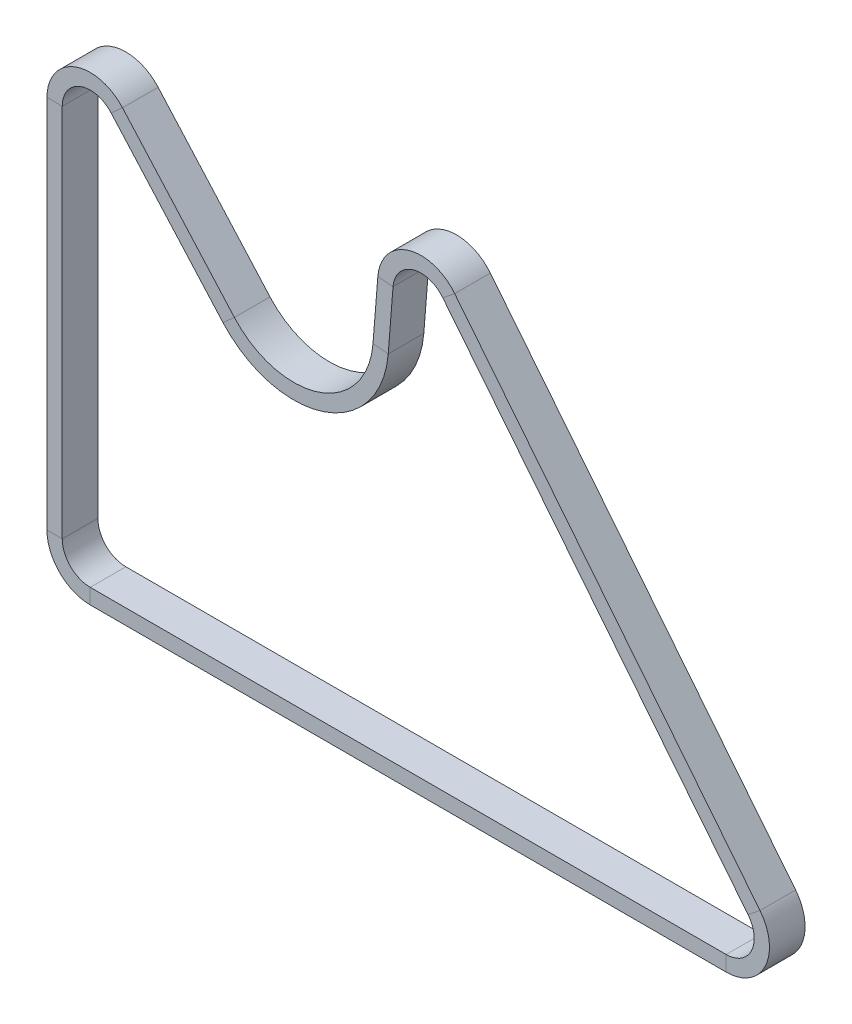
ISO-10303-21;
HEADER;
FILE_DESCRIPTION(('STEP AP214'),'2;1');
FILE_NAME('part.step','',(''),(''),'','','');
FILE_SCHEMA(('AUTOMOTIVE_DESIGN { 1 0 10303 214 1 1 1 1 }'));
ENDSEC;
DATA;
#1=APPLICATION_CONTEXT('core data for automotive mechanical design processes');
#2=APPLICATION_PROTOCOL_DEFINITION('international standard','automotive_design',2000,#1);
#3=PRODUCT_CONTEXT('',#1,'mechanical');
#4=PRODUCT('Part','Part','',(#3));
#5=PRODUCT_RELATED_PRODUCT_CATEGORY('part','',(#4));
#6=PRODUCT_DEFINITION_FORMATION('','',#4);
#7=PRODUCT_DEFINITION_CONTEXT('part definition',#1,'design');
#8=PRODUCT_DEFINITION('design','',#6,#7);
#9=PRODUCT_DEFINITION_SHAPE('','',#8);
#10=(LENGTH_UNIT() NAMED_UNIT(*) SI_UNIT(.MILLI.,.METRE.));
#11=(NAMED_UNIT(*) PLANE_ANGLE_UNIT() SI_UNIT($,.RADIAN.));
#12=(NAMED_UNIT(*) SI_UNIT($,.STERADIAN.) SOLID_ANGLE_UNIT());
#13=UNCERTAINTY_MEASURE_WITH_UNIT(LENGTH_MEASURE(1.E-05),#10,'distance_accuracy_value','');
#14=(GEOMETRIC_REPRESENTATION_CONTEXT(3) GLOBAL_UNCERTAINTY_ASSIGNED_CONTEXT((#13)) GLOBAL_UNIT_ASSIGNED_CONTEXT((#10,
#11,#12)) REPRESENTATION_CONTEXT('',''));
#15=CARTESIAN_POINT('',(0.,0.,0.));
#16=DIRECTION('',(0.,0.,1.));
#17=DIRECTION('',(1.,0.,0.));
#18=AXIS2_PLACEMENT_3D('',#15,#16,#17);
#19=CARTESIAN_POINT('',(200.000000000002,-131.000000000004,-7.));
#20=DIRECTION('',(0.,1.,0.));
#21=DIRECTION('',(0.,0.,1.));
#22=AXIS2_PLACEMENT_3D('',#19,#20,#21);
#23=PLANE('',#22);
#24=DIRECTION('',(-1.,0.,0.));
#25=VECTOR('',#24,1.);
#26=CARTESIAN_POINT('',(200.000000000002,-131.000000000004,7.));
#27=LINE('',#26,#25);
#28=CARTESIAN_POINT('',(200.000000000038,-131.000000000003,7.));
#29=VERTEX_POINT('',#28);
#30=CARTESIAN_POINT('',(-49.9999999999998,-131.000000000003,7.));
#31=VERTEX_POINT('',#30);
#32=EDGE_CURVE('E11',#29,#31,#27,.T.);
#33=ORIENTED_EDGE('',*,*,#32,.F.);
#34=DIRECTION('',(0.,0.,-1.));
#35=VECTOR('',#34,1.);
#36=CARTESIAN_POINT('',(200.000000000038,-131.000000000017,-7.));
#37=LINE('',#36,#35);
#38=CARTESIAN_POINT('',(200.000000000038,-131.000000000003,-7.));
#39=VERTEX_POINT('',#38);
#40=EDGE_CURVE('E44',#29,#39,#37,.T.);
#41=ORIENTED_EDGE('',*,*,#40,.T.);
#42=DIRECTION('',(-1.,0.,0.));
#43=VECTOR('',#42,1.);
#44=CARTESIAN_POINT('',(200.000000000002,-131.000000000004,-7.));
#45=LINE('',#44,#43);
#46=CARTESIAN_POINT('',(-49.9999999999998,-131.000000000003,-7.));
#47=VERTEX_POINT('',#46);
#48=EDGE_CURVE('E192',#39,#47,#45,.T.);
#49=ORIENTED_EDGE('',*,*,#48,.T.);
#50=DIRECTION('',(0.,0.,-1.));
#51=VECTOR('',#50,1.);
#52=CARTESIAN_POINT('',(-49.9999999999998,-131.000000000003,-7.));
#53=LINE('',#52,#51);
#54=EDGE_CURVE('E195',#31,#47,#53,.T.);
#55=ORIENTED_EDGE('',*,*,#54,.F.);
#56=EDGE_LOOP('',(#33,#41,#49,#55));
#57=FACE_BOUND('',#56,.T.);
#58=ADVANCED_FACE('F41',(#57),#23,.T.);
#59=CARTESIAN_POINT('',(200.000000000002,-131.000000000004,7.));
#60=DIRECTION('',(0.,0.,1.));
#61=DIRECTION('',(0.,-1.,0.));
#62=AXIS2_PLACEMENT_3D('',#59,#60,#61);
#63=PLANE('',#62);
#64=DIRECTION('',(-1.,0.,0.));
#65=VECTOR('',#64,1.);
#66=CARTESIAN_POINT('',(200.000000000002,-137.000000000004,7.));
#67=LINE('',#66,#65);
#68=CARTESIAN_POINT('',(200.000000000038,-137.000000000003,7.));
#69=VERTEX_POINT('',#68);
#70=CARTESIAN_POINT('',(-49.9999999999998,-137.000000000003,7.));
#71=VERTEX_POINT('',#70);
#72=EDGE_CURVE('E49',#69,#71,#67,.T.);
#73=ORIENTED_EDGE('',*,*,#72,.F.);
#74=DIRECTION('',(0.,1.,0.));
#75=VECTOR('',#74,1.);
#76=CARTESIAN_POINT('',(200.000000000038,-131.000000000017,7.));
#77=LINE('',#76,#75);
#78=EDGE_CURVE('E367',#69,#29,#77,.T.);
#79=ORIENTED_EDGE('',*,*,#78,.T.);
#80=ORIENTED_EDGE('',*,*,#32,.T.);
#81=DIRECTION('',(0.,1.,0.));
#82=VECTOR('',#81,1.);
#83=CARTESIAN_POINT('',(-49.9999999999998,-131.000000000003,7.));
#84=LINE('',#83,#82);
#85=EDGE_CURVE('E220',#71,#31,#84,.T.);
#86=ORIENTED_EDGE('',*,*,#85,.F.);
#87=EDGE_LOOP('',(#73,#79,#80,#86));
#88=FACE_BOUND('',#87,.T.);
#89=ADVANCED_FACE('F449',(#88),#63,.T.);
#90=CARTESIAN_POINT('',(200.000000000002,-137.000000000004,-7.));
#91=DIRECTION('',(0.,-1.,0.));
#92=DIRECTION('',(0.,0.,-1.));
#93=AXIS2_PLACEMENT_3D('',#90,#91,#92);
#94=PLANE('',#93);
#95=DIRECTION('',(-1.,0.,0.));
#96=VECTOR('',#95,1.);
#97=CARTESIAN_POINT('',(200.000000000002,-137.000000000004,-7.));
#98=LINE('',#97,#96);
#99=CARTESIAN_POINT('',(200.000000000038,-137.000000000003,-7.));
#100=VERTEX_POINT('',#99);
#101=CARTESIAN_POINT('',(-49.9999999999998,-137.000000000003,-7.));
#102=VERTEX_POINT('',#101);
#103=EDGE_CURVE('E201',#100,#102,#98,.T.);
#104=ORIENTED_EDGE('',*,*,#103,.F.);
#105=DIRECTION('',(0.,0.,1.));
#106=VECTOR('',#105,1.);
#107=CARTESIAN_POINT('',(200.000000000038,-137.000000000017,-7.));
#108=LINE('',#107,#106);
#109=EDGE_CURVE('E312',#100,#69,#108,.T.);
#110=ORIENTED_EDGE('',*,*,#109,.T.);
#111=ORIENTED_EDGE('',*,*,#72,.T.);
#112=DIRECTION('',(0.,0.,1.));
#113=VECTOR('',#112,1.);
#114=CARTESIAN_POINT('',(-49.9999999999998,-137.000000000003,-7.));
#115=LINE('',#114,#113);
#116=EDGE_CURVE('E224',#102,#71,#115,.T.);
#117=ORIENTED_EDGE('',*,*,#116,.F.);
#118=EDGE_LOOP('',(#104,#110,#111,#117));
#119=FACE_BOUND('',#118,.T.);
#120=ADVANCED_FACE('F453',(#119),#94,.T.);
#121=CARTESIAN_POINT('',(200.000000000004,-120.000000000003,0.));
#122=DIRECTION('',(0.,0.,-1.));
#123=DIRECTION('',(-1.,0.,0.));
#124=AXIS2_PLACEMENT_3D('',#121,#122,#123);
#125=CYLINDRICAL_SURFACE('',#124,10.9999999999995);
#126=ORIENTED_EDGE('',*,*,#40,.F.);
#127=CARTESIAN_POINT('',(200.000000000004,-120.000000000003,7.));
#128=DIRECTION('',(0.,0.,-1.));
#129=DIRECTION('',(0.780868809442791,0.624695047554723,0.));
#130=AXIS2_PLACEMENT_3D('',#127,#128,#129);
#131=CIRCLE('',#130,10.9999999999995);
#132=CARTESIAN_POINT('',(208.589556903873,-113.128354476901,7.));
#133=VERTEX_POINT('',#132);
#134=EDGE_CURVE('E406',#133,#29,#131,.T.);
#135=ORIENTED_EDGE('',*,*,#134,.F.);
#136=DIRECTION('',(0.,0.,-1.));
#137=VECTOR('',#136,1.);
#138=CARTESIAN_POINT('',(208.589556903873,-113.128354476901,-7.));
#139=LINE('',#138,#137);
#140=CARTESIAN_POINT('',(208.589556903873,-113.128354476901,-7.));
#141=VERTEX_POINT('',#140);
#142=EDGE_CURVE('E315',#133,#141,#139,.T.);
#143=ORIENTED_EDGE('',*,*,#142,.T.);
#144=CARTESIAN_POINT('',(200.000000000004,-120.000000000003,-7.));
#145=DIRECTION('',(0.,0.,-1.));
#146=DIRECTION('',(0.780868809442791,0.624695047554723,0.));
#147=AXIS2_PLACEMENT_3D('',#144,#145,#146);
#148=CIRCLE('',#147,10.9999999999995);
#149=EDGE_CURVE('E309',#141,#39,#148,.T.);
#150=ORIENTED_EDGE('',*,*,#149,.T.);
#151=EDGE_LOOP('',(#126,#135,#143,#150));
#152=FACE_BOUND('',#151,.T.);
#153=ADVANCED_FACE('F425',(#152),#125,.F.);
#154=CARTESIAN_POINT('',(208.589556903874,-113.128354476902,7.));
#155=DIRECTION('',(0.,0.,1.));
#156=DIRECTION('',(1.,0.,0.));
#157=AXIS2_PLACEMENT_3D('',#154,#155,#156);
#158=PLANE('',#157);
#159=ORIENTED_EDGE('',*,*,#134,.T.);
#160=ORIENTED_EDGE('',*,*,#78,.F.);
#161=CARTESIAN_POINT('',(200.000000000004,-120.000000000003,7.));
#162=DIRECTION('',(0.,0.,-1.));
#163=DIRECTION('',(0.780868809442796,0.624695047554718,0.));
#164=AXIS2_PLACEMENT_3D('',#161,#162,#163);
#165=CIRCLE('',#164,16.9999999999995);
#166=CARTESIAN_POINT('',(213.274769760531,-109.380184191575,7.));
#167=VERTEX_POINT('',#166);
#168=EDGE_CURVE('E364',#167,#69,#165,.T.);
#169=ORIENTED_EDGE('',*,*,#168,.F.);
#170=DIRECTION('',(-0.780868809443032,-0.624695047554422,0.));
#171=VECTOR('',#170,1.);
#172=CARTESIAN_POINT('',(208.589556903873,-113.128354476901,7.));
#173=LINE('',#172,#171);
#174=EDGE_CURVE('E360',#167,#133,#173,.T.);
#175=ORIENTED_EDGE('',*,*,#174,.T.);
#176=EDGE_LOOP('',(#159,#160,#169,#175));
#177=FACE_BOUND('',#176,.T.);
#178=ADVANCED_FACE('F462',(#177),#158,.T.);
#179=CARTESIAN_POINT('',(200.000000000004,-120.000000000003,0.));
#180=DIRECTION('',(0.,0.,-1.));
#181=DIRECTION('',(-1.,0.,0.));
#182=AXIS2_PLACEMENT_3D('',#179,#180,#181);
#183=CYLINDRICAL_SURFACE('',#182,16.9999999999995);
#184=ORIENTED_EDGE('',*,*,#168,.T.);
#185=ORIENTED_EDGE('',*,*,#109,.F.);
#186=CARTESIAN_POINT('',(200.000000000004,-120.000000000003,-7.));
#187=DIRECTION('',(0.,0.,-1.));
#188=DIRECTION('',(0.780868809442796,0.624695047554718,0.));
#189=AXIS2_PLACEMENT_3D('',#186,#187,#188);
#190=CIRCLE('',#189,16.9999999999995);
#191=CARTESIAN_POINT('',(213.274769760531,-109.380184191575,-7.));
#192=VERTEX_POINT('',#191);
#193=EDGE_CURVE('E308',#192,#100,#190,.T.);
#194=ORIENTED_EDGE('',*,*,#193,.F.);
#195=DIRECTION('',(0.,0.,1.));
#196=VECTOR('',#195,1.);
#197=CARTESIAN_POINT('',(213.274769760531,-109.380184191575,-7.));
#198=LINE('',#197,#196);
#199=EDGE_CURVE('E301',#192,#167,#198,.T.);
#200=ORIENTED_EDGE('',*,*,#199,.T.);
#201=EDGE_LOOP('',(#184,#185,#194,#200));
#202=FACE_BOUND('',#201,.T.);
#203=ADVANCED_FACE('F433',(#202),#183,.T.);
#204=CARTESIAN_POINT('',(208.589556903874,-113.128354476902,-7.));
#205=DIRECTION('',(0.,0.,-1.));
#206=DIRECTION('',(-1.,0.,0.));
#207=AXIS2_PLACEMENT_3D('',#204,#205,#206);
#208=PLANE('',#207);
#209=ORIENTED_EDGE('',*,*,#193,.T.);
#210=DIRECTION('',(0.,-1.,0.));
#211=VECTOR('',#210,1.);
#212=CARTESIAN_POINT('',(200.000000000038,-131.000000000017,-7.));
#213=LINE('',#212,#211);
#214=EDGE_CURVE('E306',#39,#100,#213,.T.);
#215=ORIENTED_EDGE('',*,*,#214,.F.);
#216=ORIENTED_EDGE('',*,*,#149,.F.);
#217=DIRECTION('',(0.780868809443032,0.624695047554422,0.));
#218=VECTOR('',#217,1.);
#219=CARTESIAN_POINT('',(208.589556903873,-113.128354476901,-7.));
#220=LINE('',#219,#218);
#221=EDGE_CURVE('E298',#141,#192,#220,.T.);
#222=ORIENTED_EDGE('',*,*,#221,.T.);
#223=EDGE_LOOP('',(#209,#215,#216,#222));
#224=FACE_BOUND('',#223,.T.);
#225=ADVANCED_FACE('F430',(#224),#208,.T.);
#226=CARTESIAN_POINT('',(88.5895569038716,36.8716455230975,-7.));
#227=DIRECTION('',(-0.780868809443024,-0.624695047554433,0.));
#228=DIRECTION('',(0.624695047554433,-0.780868809443024,0.));
#229=AXIS2_PLACEMENT_3D('',#226,#227,#228);
#230=PLANE('',#229);
#231=ORIENTED_EDGE('',*,*,#142,.F.);
#232=DIRECTION('',(0.624695047554433,-0.780868809443024,0.));
#233=VECTOR('',#232,1.);
#234=CARTESIAN_POINT('',(88.5895569038716,36.8716455230975,7.));
#235=LINE('',#234,#233);
#236=CARTESIAN_POINT('',(88.5895569038716,36.8716455230975,7.));
#237=VERTEX_POINT('',#236);
#238=EDGE_CURVE('E115',#237,#133,#235,.T.);
#239=ORIENTED_EDGE('',*,*,#238,.F.);
#240=DIRECTION('',(0.,0.,-1.));
#241=VECTOR('',#240,1.);
#242=CARTESIAN_POINT('',(88.5895569038716,36.8716455230975,-7.));
#243=LINE('',#242,#241);
#244=CARTESIAN_POINT('',(88.5895569038716,36.8716455230975,-7.));
#245=VERTEX_POINT('',#244);
#246=EDGE_CURVE('E305',#237,#245,#243,.T.);
#247=ORIENTED_EDGE('',*,*,#246,.T.);
#248=DIRECTION('',(0.624695047554433,-0.780868809443024,0.));
#249=VECTOR('',#248,1.);
#250=CARTESIAN_POINT('',(88.5895569038716,36.8716455230975,-7.));
#251=LINE('',#250,#249);
#252=EDGE_CURVE('E303',#245,#141,#251,.T.);
#253=ORIENTED_EDGE('',*,*,#252,.T.);
#254=EDGE_LOOP('',(#231,#239,#247,#253));
#255=FACE_BOUND('',#254,.T.);
#256=ADVANCED_FACE('F444',(#255),#230,.T.);
#257=CARTESIAN_POINT('',(88.5895569038716,36.8716455230975,7.));
#258=DIRECTION('',(0.,0.,1.));
#259=DIRECTION('',(1.,0.,0.));
#260=AXIS2_PLACEMENT_3D('',#257,#258,#259);
#261=PLANE('',#260);
#262=ORIENTED_EDGE('',*,*,#238,.T.);
#263=ORIENTED_EDGE('',*,*,#174,.F.);
#264=DIRECTION('',(0.624695047554433,-0.780868809443024,0.));
#265=VECTOR('',#264,1.);
#266=CARTESIAN_POINT('',(93.2747697605298,40.619815808424,7.));
#267=LINE('',#266,#265);
#268=CARTESIAN_POINT('',(93.2747697605298,40.619815808424,7.));
#269=VERTEX_POINT('',#268);
#270=EDGE_CURVE('E125',#269,#167,#267,.T.);
#271=ORIENTED_EDGE('',*,*,#270,.F.);
#272=DIRECTION('',(-0.780868809443032,-0.624695047554422,0.));
#273=VECTOR('',#272,1.);
#274=CARTESIAN_POINT('',(88.5895569038716,36.8716455230975,7.));
#275=LINE('',#274,#273);
#276=EDGE_CURVE('E357',#269,#237,#275,.T.);
#277=ORIENTED_EDGE('',*,*,#276,.T.);
#278=EDGE_LOOP('',(#262,#263,#271,#277));
#279=FACE_BOUND('',#278,.T.);
#280=ADVANCED_FACE('F436',(#279),#261,.T.);
#281=CARTESIAN_POINT('',(93.2747697605298,40.619815808424,-7.));
#282=DIRECTION('',(0.780868809443024,0.624695047554433,0.));
#283=DIRECTION('',(-0.624695047554433,0.780868809443024,0.));
#284=AXIS2_PLACEMENT_3D('',#281,#282,#283);
#285=PLANE('',#284);
#286=ORIENTED_EDGE('',*,*,#270,.T.);
#287=ORIENTED_EDGE('',*,*,#199,.F.);
#288=DIRECTION('',(0.624695047554433,-0.780868809443024,0.));
#289=VECTOR('',#288,1.);
#290=CARTESIAN_POINT('',(93.2747697605298,40.619815808424,-7.));
#291=LINE('',#290,#289);
#292=CARTESIAN_POINT('',(93.2747697605298,40.619815808424,-7.));
#293=VERTEX_POINT('',#292);
#294=EDGE_CURVE('E133',#293,#192,#291,.T.);
#295=ORIENTED_EDGE('',*,*,#294,.F.);
#296=DIRECTION('',(0.,0.,1.));
#297=VECTOR('',#296,1.);
#298=CARTESIAN_POINT('',(93.2747697605298,40.619815808424,-7.));
#299=LINE('',#298,#297);
#300=EDGE_CURVE('E294',#293,#269,#299,.T.);
#301=ORIENTED_EDGE('',*,*,#300,.T.);
#302=EDGE_LOOP('',(#286,#287,#295,#301));
#303=FACE_BOUND('',#302,.T.);
#304=ADVANCED_FACE('F434',(#303),#285,.T.);
#305=CARTESIAN_POINT('',(88.5895569038716,36.8716455230975,-7.));
#306=DIRECTION('',(0.,0.,-1.));
#307=DIRECTION('',(-1.,0.,0.));
#308=AXIS2_PLACEMENT_3D('',#305,#306,#307);
#309=PLANE('',#308);
#310=ORIENTED_EDGE('',*,*,#294,.T.);
#311=ORIENTED_EDGE('',*,*,#221,.F.);
#312=ORIENTED_EDGE('',*,*,#252,.F.);
#313=DIRECTION('',(0.780868809443032,0.624695047554422,0.));
#314=VECTOR('',#313,1.);
#315=CARTESIAN_POINT('',(88.5895569038716,36.8716455230975,-7.));
#316=LINE('',#315,#314);
#317=EDGE_CURVE('E288',#245,#293,#316,.T.);
#318=ORIENTED_EDGE('',*,*,#317,.T.);
#319=EDGE_LOOP('',(#310,#311,#312,#318));
#320=FACE_BOUND('',#319,.T.);
#321=ADVANCED_FACE('F428',(#320),#309,.T.);
#322=CARTESIAN_POINT('',(79.9999999999984,29.9999999999987,0.));
#323=DIRECTION('',(0.,0.,-1.));
#324=DIRECTION('',(-1.,0.,0.));
#325=AXIS2_PLACEMENT_3D('',#322,#323,#324);
#326=CYLINDRICAL_SURFACE('',#325,11.);
#327=ORIENTED_EDGE('',*,*,#246,.F.);
#328=CARTESIAN_POINT('',(79.9999999999984,29.9999999999987,7.));
#329=DIRECTION('',(0.,0.,-1.));
#330=DIRECTION('',(-0.996829067740474,0.0795726693510819,0.));
#331=AXIS2_PLACEMENT_3D('',#328,#329,#330);
#332=CIRCLE('',#331,11.);
#333=CARTESIAN_POINT('',(69.0348802548532,30.8752993628606,7.));
#334=VERTEX_POINT('',#333);
#335=EDGE_CURVE('E399',#334,#237,#332,.T.);
#336=ORIENTED_EDGE('',*,*,#335,.F.);
#337=DIRECTION('',(0.,0.,-1.));
#338=VECTOR('',#337,1.);
#339=CARTESIAN_POINT('',(69.0348802548532,30.8752993628606,-7.));
#340=LINE('',#339,#338);
#341=CARTESIAN_POINT('',(69.0348802548532,30.8752993628606,-7.));
#342=VERTEX_POINT('',#341);
#343=EDGE_CURVE('E297',#334,#342,#340,.T.);
#344=ORIENTED_EDGE('',*,*,#343,.T.);
#345=CARTESIAN_POINT('',(79.9999999999984,29.9999999999987,-7.));
#346=DIRECTION('',(0.,0.,-1.));
#347=DIRECTION('',(-0.996829067740474,0.0795726693510819,0.));
#348=AXIS2_PLACEMENT_3D('',#345,#346,#347);
#349=CIRCLE('',#348,11.);
#350=EDGE_CURVE('E291',#342,#245,#349,.T.);
#351=ORIENTED_EDGE('',*,*,#350,.T.);
#352=EDGE_LOOP('',(#327,#336,#344,#351));
#353=FACE_BOUND('',#352,.T.);
#354=ADVANCED_FACE('F442',(#353),#326,.F.);
#355=CARTESIAN_POINT('',(69.0348802548532,30.8752993628606,7.));
#356=DIRECTION('',(0.,0.,1.));
#357=DIRECTION('',(1.,0.,0.));
#358=AXIS2_PLACEMENT_3D('',#355,#356,#357);
#359=PLANE('',#358);
#360=ORIENTED_EDGE('',*,*,#335,.T.);
#361=ORIENTED_EDGE('',*,*,#276,.F.);
#362=CARTESIAN_POINT('',(79.9999999999984,29.9999999999987,7.));
#363=DIRECTION('',(0.,0.,-1.));
#364=DIRECTION('',(-0.996829067740474,0.0795726693510878,0.));
#365=AXIS2_PLACEMENT_3D('',#362,#363,#364);
#366=CIRCLE('',#365,17.);
#367=CARTESIAN_POINT('',(63.0539058484104,31.3527353789672,7.));
#368=VERTEX_POINT('',#367);
#369=EDGE_CURVE('E354',#368,#269,#366,.T.);
#370=ORIENTED_EDGE('',*,*,#369,.F.);
#371=DIRECTION('',(0.996829067740473,-0.0795726693510994,0.));
#372=VECTOR('',#371,1.);
#373=CARTESIAN_POINT('',(69.0348802548532,30.8752993628606,7.));
#374=LINE('',#373,#372);
#375=EDGE_CURVE('E352',#368,#334,#374,.T.);
#376=ORIENTED_EDGE('',*,*,#375,.T.);
#377=EDGE_LOOP('',(#360,#361,#370,#376));
#378=FACE_BOUND('',#377,.T.);
#379=ADVANCED_FACE('F499',(#378),#359,.T.);
#380=CARTESIAN_POINT('',(79.9999999999984,29.9999999999987,0.));
#381=DIRECTION('',(0.,0.,-1.));
#382=DIRECTION('',(-1.,0.,0.));
#383=AXIS2_PLACEMENT_3D('',#380,#381,#382);
#384=CYLINDRICAL_SURFACE('',#383,17.);
#385=ORIENTED_EDGE('',*,*,#369,.T.);
#386=ORIENTED_EDGE('',*,*,#300,.F.);
#387=CARTESIAN_POINT('',(79.9999999999984,29.9999999999987,-7.));
#388=DIRECTION('',(0.,0.,-1.));
#389=DIRECTION('',(-0.996829067740474,0.0795726693510878,0.));
#390=AXIS2_PLACEMENT_3D('',#387,#388,#389);
#391=CIRCLE('',#390,17.);
#392=CARTESIAN_POINT('',(63.0539058484104,31.3527353789672,-7.));
#393=VERTEX_POINT('',#392);
#394=EDGE_CURVE('E290',#393,#293,#391,.T.);
#395=ORIENTED_EDGE('',*,*,#394,.F.);
#396=DIRECTION('',(0.,0.,1.));
#397=VECTOR('',#396,1.);
#398=CARTESIAN_POINT('',(63.0539058484104,31.3527353789672,-7.));
#399=LINE('',#398,#397);
#400=EDGE_CURVE('E284',#393,#368,#399,.T.);
#401=ORIENTED_EDGE('',*,*,#400,.T.);
#402=EDGE_LOOP('',(#385,#386,#395,#401));
#403=FACE_BOUND('',#402,.T.);
#404=ADVANCED_FACE('F557',(#403),#384,.T.);
#405=CARTESIAN_POINT('',(69.0348802548532,30.8752993628606,-7.));
#406=DIRECTION('',(0.,0.,-1.));
#407=DIRECTION('',(-1.,0.,0.));
#408=AXIS2_PLACEMENT_3D('',#405,#406,#407);
#409=PLANE('',#408);
#410=ORIENTED_EDGE('',*,*,#394,.T.);
#411=ORIENTED_EDGE('',*,*,#317,.F.);
#412=ORIENTED_EDGE('',*,*,#350,.F.);
#413=DIRECTION('',(-0.996829067740473,0.0795726693510994,0.));
#414=VECTOR('',#413,1.);
#415=CARTESIAN_POINT('',(69.0348802548532,30.8752993628606,-7.));
#416=LINE('',#415,#414);
#417=EDGE_CURVE('E277',#342,#393,#416,.T.);
#418=ORIENTED_EDGE('',*,*,#417,.T.);
#419=EDGE_LOOP('',(#410,#411,#412,#418));
#420=FACE_BOUND('',#419,.T.);
#421=ADVANCED_FACE('F495',(#420),#409,.T.);
#422=CARTESIAN_POINT('',(67.1318827733333,7.03591806667277,-7.));
#423=DIRECTION('',(0.996829067740474,-0.079572669351086,0.));
#424=DIRECTION('',(0.079572669351086,0.996829067740474,0.));
#425=AXIS2_PLACEMENT_3D('',#422,#423,#424);
#426=PLANE('',#425);
#427=ORIENTED_EDGE('',*,*,#343,.F.);
#428=DIRECTION('',(0.079572669351086,0.996829067740474,0.));
#429=VECTOR('',#428,1.);
#430=CARTESIAN_POINT('',(67.1318827733333,7.03591806667277,7.));
#431=LINE('',#430,#429);
#432=CARTESIAN_POINT('',(67.1318827733332,7.03591806667278,7.));
#433=VERTEX_POINT('',#432);
#434=EDGE_CURVE('E395',#433,#334,#431,.T.);
#435=ORIENTED_EDGE('',*,*,#434,.F.);
#436=DIRECTION('',(0.,0.,-1.));
#437=VECTOR('',#436,1.);
#438=CARTESIAN_POINT('',(67.1318827733333,7.03591806667277,-7.));
#439=LINE('',#438,#437);
#440=CARTESIAN_POINT('',(67.1318827733332,7.03591806667278,-7.));
#441=VERTEX_POINT('',#440);
#442=EDGE_CURVE('E287',#433,#441,#439,.T.);
#443=ORIENTED_EDGE('',*,*,#442,.T.);
#444=DIRECTION('',(0.079572669351086,0.996829067740474,0.));
#445=VECTOR('',#444,1.);
#446=CARTESIAN_POINT('',(67.1318827733333,7.03591806667277,-7.));
#447=LINE('',#446,#445);
#448=EDGE_CURVE('E281',#441,#342,#447,.T.);
#449=ORIENTED_EDGE('',*,*,#448,.T.);
#450=EDGE_LOOP('',(#427,#435,#443,#449));
#451=FACE_BOUND('',#450,.T.);
#452=ADVANCED_FACE('F491',(#451),#426,.T.);
#453=CARTESIAN_POINT('',(67.1318827733333,7.03591806667277,7.));
#454=DIRECTION('',(0.,0.,1.));
#455=DIRECTION('',(1.,0.,0.));
#456=AXIS2_PLACEMENT_3D('',#453,#454,#455);
#457=PLANE('',#456);
#458=ORIENTED_EDGE('',*,*,#434,.T.);
#459=ORIENTED_EDGE('',*,*,#375,.F.);
#460=DIRECTION('',(0.079572669351086,0.996829067740474,0.));
#461=VECTOR('',#460,1.);
#462=CARTESIAN_POINT('',(61.1509083668904,7.51335408277937,7.));
#463=LINE('',#462,#461);
#464=CARTESIAN_POINT('',(61.1509083668904,7.51335408277938,7.));
#465=VERTEX_POINT('',#464);
#466=EDGE_CURVE('E349',#465,#368,#463,.T.);
#467=ORIENTED_EDGE('',*,*,#466,.F.);
#468=DIRECTION('',(0.996829067740473,-0.0795726693510993,0.));
#469=VECTOR('',#468,1.);
#470=CARTESIAN_POINT('',(67.1318827733333,7.03591806667277,7.));
#471=LINE('',#470,#469);
#472=EDGE_CURVE('E346',#465,#433,#471,.T.);
#473=ORIENTED_EDGE('',*,*,#472,.T.);
#474=EDGE_LOOP('',(#458,#459,#467,#473));
#475=FACE_BOUND('',#474,.T.);
#476=ADVANCED_FACE('F494',(#475),#457,.T.);
#477=CARTESIAN_POINT('',(61.1509083668904,7.51335408277937,-7.));
#478=DIRECTION('',(-0.996829067740474,0.079572669351086,0.));
#479=DIRECTION('',(-0.079572669351086,-0.996829067740474,0.));
#480=AXIS2_PLACEMENT_3D('',#477,#478,#479);
#481=PLANE('',#480);
#482=ORIENTED_EDGE('',*,*,#466,.T.);
#483=ORIENTED_EDGE('',*,*,#400,.F.);
#484=DIRECTION('',(0.079572669351086,0.996829067740474,0.));
#485=VECTOR('',#484,1.);
#486=CARTESIAN_POINT('',(61.1509083668904,7.51335408277937,-7.));
#487=LINE('',#486,#485);
#488=CARTESIAN_POINT('',(61.1509083668904,7.51335408277938,-7.));
#489=VERTEX_POINT('',#488);
#490=EDGE_CURVE('E280',#489,#393,#487,.T.);
#491=ORIENTED_EDGE('',*,*,#490,.F.);
#492=DIRECTION('',(0.,0.,1.));
#493=VECTOR('',#492,1.);
#494=CARTESIAN_POINT('',(61.1509083668904,7.51335408277937,-7.));
#495=LINE('',#494,#493);
#496=EDGE_CURVE('E273',#489,#465,#495,.T.);
#497=ORIENTED_EDGE('',*,*,#496,.T.);
#498=EDGE_LOOP('',(#482,#483,#491,#497));
#499=FACE_BOUND('',#498,.T.);
#500=ADVANCED_FACE('F555',(#499),#481,.T.);
#501=CARTESIAN_POINT('',(67.1318827733333,7.03591806667277,-7.));
#502=DIRECTION('',(0.,0.,-1.));
#503=DIRECTION('',(-1.,0.,0.));
#504=AXIS2_PLACEMENT_3D('',#501,#502,#503);
#505=PLANE('',#504);
#506=ORIENTED_EDGE('',*,*,#490,.T.);
#507=ORIENTED_EDGE('',*,*,#417,.F.);
#508=ORIENTED_EDGE('',*,*,#448,.F.);
#509=DIRECTION('',(-0.996829067740473,0.0795726693510993,0.));
#510=VECTOR('',#509,1.);
#511=CARTESIAN_POINT('',(67.1318827733333,7.03591806667277,-7.));
#512=LINE('',#511,#510);
#513=EDGE_CURVE('E266',#441,#489,#512,.T.);
#514=ORIENTED_EDGE('',*,*,#513,.T.);
#515=EDGE_LOOP('',(#506,#507,#508,#514));
#516=FACE_BOUND('',#515,.T.);
#517=ADVANCED_FACE('F489',(#516),#505,.T.);
#518=CARTESIAN_POINT('',(30.0000000000006,10.0000000000008,0.));
#519=DIRECTION('',(0.,0.,1.));
#520=DIRECTION('',(1.,0.,0.));
#521=AXIS2_PLACEMENT_3D('',#518,#519,#520);
#522=CYLINDRICAL_SURFACE('',#521,37.25);
#523=ORIENTED_EDGE('',*,*,#442,.F.);
#524=CARTESIAN_POINT('',(30.0000000000006,10.0000000000008,7.));
#525=DIRECTION('',(0.,0.,1.));
#526=DIRECTION('',(-0.746796329131911,-0.665052812034581,0.));
#527=AXIS2_PLACEMENT_3D('',#524,#525,#526);
#528=CIRCLE('',#527,37.25);
#529=CARTESIAN_POINT('',(2.18183673983689,-14.7732172482874,7.));
#530=VERTEX_POINT('',#529);
#531=EDGE_CURVE('E390',#530,#433,#528,.T.);
#532=ORIENTED_EDGE('',*,*,#531,.F.);
#533=DIRECTION('',(0.,0.,-1.));
#534=VECTOR('',#533,1.);
#535=CARTESIAN_POINT('',(2.18183673983691,-14.7732172482874,-7.));
#536=LINE('',#535,#534);
#537=CARTESIAN_POINT('',(2.18183673983689,-14.7732172482874,-7.));
#538=VERTEX_POINT('',#537);
#539=EDGE_CURVE('E276',#530,#538,#536,.T.);
#540=ORIENTED_EDGE('',*,*,#539,.T.);
#541=CARTESIAN_POINT('',(30.0000000000006,10.0000000000008,-7.));
#542=DIRECTION('',(0.,0.,1.));
#543=DIRECTION('',(-0.746796329131911,-0.665052812034581,0.));
#544=AXIS2_PLACEMENT_3D('',#541,#542,#543);
#545=CIRCLE('',#544,37.25);
#546=EDGE_CURVE('E270',#538,#441,#545,.T.);
#547=ORIENTED_EDGE('',*,*,#546,.T.);
#548=EDGE_LOOP('',(#523,#532,#540,#547));
#549=FACE_BOUND('',#548,.T.);
#550=ADVANCED_FACE('F485',(#549),#522,.T.);
#551=CARTESIAN_POINT('',(2.18183673983688,-14.7732172482874,7.));
#552=DIRECTION('',(0.,0.,1.));
#553=DIRECTION('',(1.,0.,0.));
#554=AXIS2_PLACEMENT_3D('',#551,#552,#553);
#555=PLANE('',#554);
#556=ORIENTED_EDGE('',*,*,#531,.T.);
#557=ORIENTED_EDGE('',*,*,#472,.F.);
#558=CARTESIAN_POINT('',(30.0000000000006,10.0000000000008,7.));
#559=DIRECTION('',(0.,0.,1.));
#560=DIRECTION('',(-0.746796329131909,-0.665052812034582,0.));
#561=AXIS2_PLACEMENT_3D('',#558,#559,#560);
#562=CIRCLE('',#561,31.25);
#563=CARTESIAN_POINT('',(6.66261471462838,-10.78290037608,7.));
#564=VERTEX_POINT('',#563);
#565=EDGE_CURVE('E343',#564,#465,#562,.T.);
#566=ORIENTED_EDGE('',*,*,#565,.F.);
#567=DIRECTION('',(-0.746796329131918,-0.665052812034572,0.));
#568=VECTOR('',#567,1.);
#569=CARTESIAN_POINT('',(2.18183673983691,-14.7732172482874,7.));
#570=LINE('',#569,#568);
#571=EDGE_CURVE('E340',#564,#530,#570,.T.);
#572=ORIENTED_EDGE('',*,*,#571,.T.);
#573=EDGE_LOOP('',(#556,#557,#566,#572));
#574=FACE_BOUND('',#573,.T.);
#575=ADVANCED_FACE('F488',(#574),#555,.T.);
#576=CARTESIAN_POINT('',(30.0000000000006,10.0000000000008,0.));
#577=DIRECTION('',(0.,0.,1.));
#578=DIRECTION('',(1.,0.,0.));
#579=AXIS2_PLACEMENT_3D('',#576,#577,#578);
#580=CYLINDRICAL_SURFACE('',#579,31.25);
#581=ORIENTED_EDGE('',*,*,#565,.T.);
#582=ORIENTED_EDGE('',*,*,#496,.F.);
#583=CARTESIAN_POINT('',(30.0000000000006,10.0000000000008,-7.));
#584=DIRECTION('',(0.,0.,1.));
#585=DIRECTION('',(-0.746796329131909,-0.665052812034582,0.));
#586=AXIS2_PLACEMENT_3D('',#583,#584,#585);
#587=CIRCLE('',#586,31.25);
#588=CARTESIAN_POINT('',(6.66261471462838,-10.78290037608,-7.));
#589=VERTEX_POINT('',#588);
#590=EDGE_CURVE('E269',#589,#489,#587,.T.);
#591=ORIENTED_EDGE('',*,*,#590,.F.);
#592=DIRECTION('',(0.,0.,1.));
#593=VECTOR('',#592,1.);
#594=CARTESIAN_POINT('',(6.6626147146284,-10.78290037608,-7.));
#595=LINE('',#594,#593);
#596=EDGE_CURVE('E262',#589,#564,#595,.T.);
#597=ORIENTED_EDGE('',*,*,#596,.T.);
#598=EDGE_LOOP('',(#581,#582,#591,#597));
#599=FACE_BOUND('',#598,.T.);
#600=ADVANCED_FACE('F541',(#599),#580,.F.);
#601=CARTESIAN_POINT('',(2.18183673983688,-14.7732172482874,-7.));
#602=DIRECTION('',(0.,0.,-1.));
#603=DIRECTION('',(-1.,0.,0.));
#604=AXIS2_PLACEMENT_3D('',#601,#602,#603);
#605=PLANE('',#604);
#606=ORIENTED_EDGE('',*,*,#590,.T.);
#607=ORIENTED_EDGE('',*,*,#513,.F.);
#608=ORIENTED_EDGE('',*,*,#546,.F.);
#609=DIRECTION('',(0.746796329131918,0.665052812034572,0.));
#610=VECTOR('',#609,1.);
#611=CARTESIAN_POINT('',(2.18183673983691,-14.7732172482874,-7.));
#612=LINE('',#611,#610);
#613=EDGE_CURVE('E255',#538,#589,#612,.T.);
#614=ORIENTED_EDGE('',*,*,#613,.T.);
#615=EDGE_LOOP('',(#606,#607,#608,#614));
#616=FACE_BOUND('',#615,.T.);
#617=ADVANCED_FACE('F483',(#616),#605,.T.);
#618=CARTESIAN_POINT('',(-41.7852403795516,34.5979773414613,-7.));
#619=DIRECTION('',(-0.74679632913191,-0.665052812034582,0.));
#620=DIRECTION('',(0.665052812034582,-0.74679632913191,0.));
#621=AXIS2_PLACEMENT_3D('',#618,#619,#620);
#622=PLANE('',#621);
#623=ORIENTED_EDGE('',*,*,#539,.F.);
#624=DIRECTION('',(0.665052812034582,-0.74679632913191,0.));
#625=VECTOR('',#624,1.);
#626=CARTESIAN_POINT('',(-41.7852403795516,34.5979773414613,7.));
#627=LINE('',#626,#625);
#628=CARTESIAN_POINT('',(-41.7852403795516,34.5979773414613,7.));
#629=VERTEX_POINT('',#628);
#630=EDGE_CURVE('E385',#629,#530,#627,.T.);
#631=ORIENTED_EDGE('',*,*,#630,.F.);
#632=DIRECTION('',(0.,0.,-1.));
#633=VECTOR('',#632,1.);
#634=CARTESIAN_POINT('',(-41.7852403795516,34.5979773414613,-7.));
#635=LINE('',#634,#633);
#636=CARTESIAN_POINT('',(-41.7852403795516,34.5979773414613,-7.));
#637=VERTEX_POINT('',#636);
#638=EDGE_CURVE('E265',#629,#637,#635,.T.);
#639=ORIENTED_EDGE('',*,*,#638,.T.);
#640=DIRECTION('',(0.665052812034582,-0.74679632913191,0.));
#641=VECTOR('',#640,1.);
#642=CARTESIAN_POINT('',(-41.7852403795516,34.5979773414613,-7.));
#643=LINE('',#642,#641);
#644=EDGE_CURVE('E259',#637,#538,#643,.T.);
#645=ORIENTED_EDGE('',*,*,#644,.T.);
#646=EDGE_LOOP('',(#623,#631,#639,#645));
#647=FACE_BOUND('',#646,.T.);
#648=ADVANCED_FACE('F479',(#647),#622,.T.);
#649=CARTESIAN_POINT('',(-41.7852403795516,34.5979773414613,7.));
#650=DIRECTION('',(0.,0.,1.));
#651=DIRECTION('',(1.,0.,0.));
#652=AXIS2_PLACEMENT_3D('',#649,#650,#651);
#653=PLANE('',#652);
#654=ORIENTED_EDGE('',*,*,#630,.T.);
#655=ORIENTED_EDGE('',*,*,#571,.F.);
#656=DIRECTION('',(0.665052812034582,-0.74679632913191,0.));
#657=VECTOR('',#656,1.);
#658=CARTESIAN_POINT('',(-37.3044624047601,38.5882942136687,7.));
#659=LINE('',#658,#657);
#660=CARTESIAN_POINT('',(-37.3044624047601,38.5882942136687,7.));
#661=VERTEX_POINT('',#660);
#662=EDGE_CURVE('E337',#661,#564,#659,.T.);
#663=ORIENTED_EDGE('',*,*,#662,.F.);
#664=DIRECTION('',(-0.746796329131918,-0.665052812034572,0.));
#665=VECTOR('',#664,1.);
#666=CARTESIAN_POINT('',(-41.7852403795516,34.5979773414613,7.));
#667=LINE('',#666,#665);
#668=EDGE_CURVE('E334',#661,#629,#667,.T.);
#669=ORIENTED_EDGE('',*,*,#668,.T.);
#670=EDGE_LOOP('',(#654,#655,#663,#669));
#671=FACE_BOUND('',#670,.T.);
#672=ADVANCED_FACE('F482',(#671),#653,.T.);
#673=CARTESIAN_POINT('',(-37.3044624047601,38.5882942136687,-7.));
#674=DIRECTION('',(0.74679632913191,0.665052812034582,0.));
#675=DIRECTION('',(-0.665052812034582,0.74679632913191,0.));
#676=AXIS2_PLACEMENT_3D('',#673,#674,#675);
#677=PLANE('',#676);
#678=ORIENTED_EDGE('',*,*,#662,.T.);
#679=ORIENTED_EDGE('',*,*,#596,.F.);
#680=DIRECTION('',(0.665052812034582,-0.74679632913191,0.));
#681=VECTOR('',#680,1.);
#682=CARTESIAN_POINT('',(-37.3044624047601,38.5882942136687,-7.));
#683=LINE('',#682,#681);
#684=CARTESIAN_POINT('',(-37.3044624047601,38.5882942136687,-7.));
#685=VERTEX_POINT('',#684);
#686=EDGE_CURVE('E258',#685,#589,#683,.T.);
#687=ORIENTED_EDGE('',*,*,#686,.F.);
#688=DIRECTION('',(0.,0.,1.));
#689=VECTOR('',#688,1.);
#690=CARTESIAN_POINT('',(-37.3044624047601,38.5882942136687,-7.));
#691=LINE('',#690,#689);
#692=EDGE_CURVE('E251',#685,#661,#691,.T.);
#693=ORIENTED_EDGE('',*,*,#692,.T.);
#694=EDGE_LOOP('',(#678,#679,#687,#693));
#695=FACE_BOUND('',#694,.T.);
#696=ADVANCED_FACE('F539',(#695),#677,.T.);
#697=CARTESIAN_POINT('',(-41.7852403795516,34.5979773414613,-7.));
#698=DIRECTION('',(0.,0.,-1.));
#699=DIRECTION('',(-1.,0.,0.));
#700=AXIS2_PLACEMENT_3D('',#697,#698,#699);
#701=PLANE('',#700);
#702=ORIENTED_EDGE('',*,*,#686,.T.);
#703=ORIENTED_EDGE('',*,*,#613,.F.);
#704=ORIENTED_EDGE('',*,*,#644,.F.);
#705=DIRECTION('',(0.746796329131918,0.665052812034572,0.));
#706=VECTOR('',#705,1.);
#707=CARTESIAN_POINT('',(-41.7852403795516,34.5979773414613,-7.));
#708=LINE('',#707,#706);
#709=EDGE_CURVE('E244',#637,#685,#708,.T.);
#710=ORIENTED_EDGE('',*,*,#709,.T.);
#711=EDGE_LOOP('',(#702,#703,#704,#710));
#712=FACE_BOUND('',#711,.T.);
#713=ADVANCED_FACE('F477',(#712),#701,.T.);
#714=CARTESIAN_POINT('',(-50.0000000000025,27.2823964090808,0.));
#715=DIRECTION('',(0.,0.,-1.));
#716=DIRECTION('',(-1.,0.,0.));
#717=AXIS2_PLACEMENT_3D('',#714,#715,#716);
#718=CYLINDRICAL_SURFACE('',#717,11.);
#719=ORIENTED_EDGE('',*,*,#638,.F.);
#720=CARTESIAN_POINT('',(-50.0000000000025,27.2823964090808,7.));
#721=DIRECTION('',(0.,0.,-1.));
#722=DIRECTION('',(-1.,0.,0.));
#723=AXIS2_PLACEMENT_3D('',#720,#721,#722);
#724=CIRCLE('',#723,11.);
#725=CARTESIAN_POINT('',(-61.0000000000025,27.2823964090806,7.));
#726=VERTEX_POINT('',#725);
#727=EDGE_CURVE('E380',#726,#629,#724,.T.);
#728=ORIENTED_EDGE('',*,*,#727,.F.);
#729=DIRECTION('',(0.,0.,-1.));
#730=VECTOR('',#729,1.);
#731=CARTESIAN_POINT('',(-61.0000000000025,27.2823964090806,-7.));
#732=LINE('',#731,#730);
#733=CARTESIAN_POINT('',(-61.0000000000025,27.2823964090806,-7.));
#734=VERTEX_POINT('',#733);
#735=EDGE_CURVE('E254',#726,#734,#732,.T.);
#736=ORIENTED_EDGE('',*,*,#735,.T.);
#737=CARTESIAN_POINT('',(-50.0000000000025,27.2823964090808,-7.));
#738=DIRECTION('',(0.,0.,-1.));
#739=DIRECTION('',(-1.,0.,0.));
#740=AXIS2_PLACEMENT_3D('',#737,#738,#739);
#741=CIRCLE('',#740,11.);
#742=EDGE_CURVE('E248',#734,#637,#741,.T.);
#743=ORIENTED_EDGE('',*,*,#742,.T.);
#744=EDGE_LOOP('',(#719,#728,#736,#743));
#745=FACE_BOUND('',#744,.T.);
#746=ADVANCED_FACE('F473',(#745),#718,.F.);
#747=CARTESIAN_POINT('',(-61.0000000000025,27.2823964090806,7.));
#748=DIRECTION('',(0.,0.,1.));
#749=DIRECTION('',(1.,0.,0.));
#750=AXIS2_PLACEMENT_3D('',#747,#748,#749);
#751=PLANE('',#750);
#752=ORIENTED_EDGE('',*,*,#727,.T.);
#753=ORIENTED_EDGE('',*,*,#668,.F.);
#754=CARTESIAN_POINT('',(-50.0000000000025,27.2823964090808,7.));
#755=DIRECTION('',(0.,0.,-1.));
#756=DIRECTION('',(-1.,0.,0.));
#757=AXIS2_PLACEMENT_3D('',#754,#755,#756);
#758=CIRCLE('',#757,17.);
#759=CARTESIAN_POINT('',(-67.0000000000025,27.2823964090806,7.));
#760=VERTEX_POINT('',#759);
#761=EDGE_CURVE('E331',#760,#661,#758,.T.);
#762=ORIENTED_EDGE('',*,*,#761,.F.);
#763=DIRECTION('',(1.,0.,0.));
#764=VECTOR('',#763,1.);
#765=CARTESIAN_POINT('',(-61.0000000000025,27.2823964090806,7.));
#766=LINE('',#765,#764);
#767=EDGE_CURVE('E328',#760,#726,#766,.T.);
#768=ORIENTED_EDGE('',*,*,#767,.T.);
#769=EDGE_LOOP('',(#752,#753,#762,#768));
#770=FACE_BOUND('',#769,.T.);
#771=ADVANCED_FACE('F476',(#770),#751,.T.);
#772=CARTESIAN_POINT('',(-50.0000000000025,27.2823964090808,0.));
#773=DIRECTION('',(0.,0.,-1.));
#774=DIRECTION('',(-1.,0.,0.));
#775=AXIS2_PLACEMENT_3D('',#772,#773,#774);
#776=CYLINDRICAL_SURFACE('',#775,17.);
#777=ORIENTED_EDGE('',*,*,#761,.T.);
#778=ORIENTED_EDGE('',*,*,#692,.F.);
#779=CARTESIAN_POINT('',(-50.0000000000025,27.2823964090808,-7.));
#780=DIRECTION('',(0.,0.,-1.));
#781=DIRECTION('',(-1.,0.,0.));
#782=AXIS2_PLACEMENT_3D('',#779,#780,#781);
#783=CIRCLE('',#782,17.);
#784=CARTESIAN_POINT('',(-67.0000000000025,27.2823964090806,-7.));
#785=VERTEX_POINT('',#784);
#786=EDGE_CURVE('E247',#785,#685,#783,.T.);
#787=ORIENTED_EDGE('',*,*,#786,.F.);
#788=DIRECTION('',(0.,0.,1.));
#789=VECTOR('',#788,1.);
#790=CARTESIAN_POINT('',(-67.0000000000025,27.2823964090806,-7.));
#791=LINE('',#790,#789);
#792=EDGE_CURVE('E240',#785,#760,#791,.T.);
#793=ORIENTED_EDGE('',*,*,#792,.T.);
#794=EDGE_LOOP('',(#777,#778,#787,#793));
#795=FACE_BOUND('',#794,.T.);
#796=ADVANCED_FACE('F523',(#795),#776,.T.);
#797=CARTESIAN_POINT('',(-61.0000000000025,27.2823964090806,-7.));
#798=DIRECTION('',(0.,0.,-1.));
#799=DIRECTION('',(-1.,0.,0.));
#800=AXIS2_PLACEMENT_3D('',#797,#798,#799);
#801=PLANE('',#800);
#802=ORIENTED_EDGE('',*,*,#786,.T.);
#803=ORIENTED_EDGE('',*,*,#709,.F.);
#804=ORIENTED_EDGE('',*,*,#742,.F.);
#805=DIRECTION('',(-1.,0.,0.));
#806=VECTOR('',#805,1.);
#807=CARTESIAN_POINT('',(-61.0000000000025,27.2823964090806,-7.));
#808=LINE('',#807,#806);
#809=EDGE_CURVE('E233',#734,#785,#808,.T.);
#810=ORIENTED_EDGE('',*,*,#809,.T.);
#811=EDGE_LOOP('',(#802,#803,#804,#810));
#812=FACE_BOUND('',#811,.T.);
#813=ADVANCED_FACE('F471',(#812),#801,.T.);
#814=CARTESIAN_POINT('',(-61.,-120.000000000004,-7.));
#815=DIRECTION('',(1.,0.,0.));
#816=DIRECTION('',(0.,1.,0.));
#817=AXIS2_PLACEMENT_3D('',#814,#815,#816);
#818=PLANE('',#817);
#819=ORIENTED_EDGE('',*,*,#735,.F.);
#820=DIRECTION('',(0.,1.,0.));
#821=VECTOR('',#820,1.);
#822=CARTESIAN_POINT('',(-61.,-120.000000000004,7.));
#823=LINE('',#822,#821);
#824=CARTESIAN_POINT('',(-61.,-120.000000000004,7.));
#825=VERTEX_POINT('',#824);
#826=EDGE_CURVE('E375',#825,#726,#823,.T.);
#827=ORIENTED_EDGE('',*,*,#826,.F.);
#828=DIRECTION('',(0.,0.,-1.));
#829=VECTOR('',#828,1.);
#830=CARTESIAN_POINT('',(-61.,-120.000000000004,-7.));
#831=LINE('',#830,#829);
#832=CARTESIAN_POINT('',(-61.,-120.000000000004,-7.));
#833=VERTEX_POINT('',#832);
#834=EDGE_CURVE('E243',#825,#833,#831,.T.);
#835=ORIENTED_EDGE('',*,*,#834,.T.);
#836=DIRECTION('',(0.,1.,0.));
#837=VECTOR('',#836,1.);
#838=CARTESIAN_POINT('',(-61.,-120.000000000004,-7.));
#839=LINE('',#838,#837);
#840=EDGE_CURVE('E237',#833,#734,#839,.T.);
#841=ORIENTED_EDGE('',*,*,#840,.T.);
#842=EDGE_LOOP('',(#819,#827,#835,#841));
#843=FACE_BOUND('',#842,.T.);
#844=ADVANCED_FACE('F467',(#843),#818,.T.);
#845=CARTESIAN_POINT('',(-61.,-120.000000000004,7.));
#846=DIRECTION('',(0.,0.,1.));
#847=DIRECTION('',(1.,0.,0.));
#848=AXIS2_PLACEMENT_3D('',#845,#846,#847);
#849=PLANE('',#848);
#850=ORIENTED_EDGE('',*,*,#826,.T.);
#851=ORIENTED_EDGE('',*,*,#767,.F.);
#852=DIRECTION('',(0.,1.,0.));
#853=VECTOR('',#852,1.);
#854=CARTESIAN_POINT('',(-67.,-120.000000000004,7.));
#855=LINE('',#854,#853);
#856=CARTESIAN_POINT('',(-67.,-120.000000000004,7.));
#857=VERTEX_POINT('',#856);
#858=EDGE_CURVE('E325',#857,#760,#855,.T.);
#859=ORIENTED_EDGE('',*,*,#858,.F.);
#860=DIRECTION('',(1.,0.,0.));
#861=VECTOR('',#860,1.);
#862=CARTESIAN_POINT('',(-61.,-120.000000000004,7.));
#863=LINE('',#862,#861);
#864=EDGE_CURVE('E322',#857,#825,#863,.T.);
#865=ORIENTED_EDGE('',*,*,#864,.T.);
#866=EDGE_LOOP('',(#850,#851,#859,#865));
#867=FACE_BOUND('',#866,.T.);
#868=ADVANCED_FACE('F470',(#867),#849,.T.);
#869=CARTESIAN_POINT('',(-67.,-120.000000000004,-7.));
#870=DIRECTION('',(-1.,0.,0.));
#871=DIRECTION('',(0.,-1.,0.));
#872=AXIS2_PLACEMENT_3D('',#869,#870,#871);
#873=PLANE('',#872);
#874=ORIENTED_EDGE('',*,*,#858,.T.);
#875=ORIENTED_EDGE('',*,*,#792,.F.);
#876=DIRECTION('',(0.,1.,0.));
#877=VECTOR('',#876,1.);
#878=CARTESIAN_POINT('',(-67.,-120.000000000004,-7.));
#879=LINE('',#878,#877);
#880=CARTESIAN_POINT('',(-67.,-120.000000000004,-7.));
#881=VERTEX_POINT('',#880);
#882=EDGE_CURVE('E236',#881,#785,#879,.T.);
#883=ORIENTED_EDGE('',*,*,#882,.F.);
#884=DIRECTION('',(0.,0.,1.));
#885=VECTOR('',#884,1.);
#886=CARTESIAN_POINT('',(-67.,-120.000000000004,-7.));
#887=LINE('',#886,#885);
#888=EDGE_CURVE('E231',#881,#857,#887,.T.);
#889=ORIENTED_EDGE('',*,*,#888,.T.);
#890=EDGE_LOOP('',(#874,#875,#883,#889));
#891=FACE_BOUND('',#890,.T.);
#892=ADVANCED_FACE('F521',(#891),#873,.T.);
#893=CARTESIAN_POINT('',(-61.,-120.000000000004,-7.));
#894=DIRECTION('',(0.,0.,-1.));
#895=DIRECTION('',(-1.,0.,0.));
#896=AXIS2_PLACEMENT_3D('',#893,#894,#895);
#897=PLANE('',#896);
#898=ORIENTED_EDGE('',*,*,#882,.T.);
#899=ORIENTED_EDGE('',*,*,#809,.F.);
#900=ORIENTED_EDGE('',*,*,#840,.F.);
#901=DIRECTION('',(-1.,0.,0.));
#902=VECTOR('',#901,1.);
#903=CARTESIAN_POINT('',(-61.,-120.000000000004,-7.));
#904=LINE('',#903,#902);
#905=EDGE_CURVE('E212',#833,#881,#904,.T.);
#906=ORIENTED_EDGE('',*,*,#905,.T.);
#907=EDGE_LOOP('',(#898,#899,#900,#906));
#908=FACE_BOUND('',#907,.T.);
#909=ADVANCED_FACE('F466',(#908),#897,.T.);
#910=CARTESIAN_POINT('',(-50.,-120.000000000003,0.));
#911=DIRECTION('',(0.,0.,-1.));
#912=DIRECTION('',(-1.,0.,0.));
#913=AXIS2_PLACEMENT_3D('',#910,#911,#912);
#914=CYLINDRICAL_SURFACE('',#913,11.);
#915=ORIENTED_EDGE('',*,*,#834,.F.);
#916=CARTESIAN_POINT('',(-50.,-120.000000000003,7.));
#917=DIRECTION('',(0.,0.,-1.));
#918=DIRECTION('',(0.,-1.,0.));
#919=AXIS2_PLACEMENT_3D('',#916,#917,#918);
#920=CIRCLE('',#919,11.);
#921=EDGE_CURVE('E219',#31,#825,#920,.T.);
#922=ORIENTED_EDGE('',*,*,#921,.F.);
#923=ORIENTED_EDGE('',*,*,#54,.T.);
#924=CARTESIAN_POINT('',(-50.,-120.000000000003,-7.));
#925=DIRECTION('',(0.,0.,-1.));
#926=DIRECTION('',(0.,-1.,0.));
#927=AXIS2_PLACEMENT_3D('',#924,#925,#926);
#928=CIRCLE('',#927,11.);
#929=EDGE_CURVE('E207',#47,#833,#928,.T.);
#930=ORIENTED_EDGE('',*,*,#929,.T.);
#931=EDGE_LOOP('',(#915,#922,#923,#930));
#932=FACE_BOUND('',#931,.T.);
#933=ADVANCED_FACE('F217',(#932),#914,.F.);
#934=CARTESIAN_POINT('',(-49.9999999999998,-131.000000000003,7.));
#935=DIRECTION('',(0.,0.,1.));
#936=DIRECTION('',(1.,0.,0.));
#937=AXIS2_PLACEMENT_3D('',#934,#935,#936);
#938=PLANE('',#937);
#939=ORIENTED_EDGE('',*,*,#921,.T.);
#940=ORIENTED_EDGE('',*,*,#864,.F.);
#941=CARTESIAN_POINT('',(-50.,-120.000000000003,7.));
#942=DIRECTION('',(0.,0.,-1.));
#943=DIRECTION('',(0.,-1.,0.));
#944=AXIS2_PLACEMENT_3D('',#941,#942,#943);
#945=CIRCLE('',#944,17.);
#946=EDGE_CURVE('E319',#71,#857,#945,.T.);
#947=ORIENTED_EDGE('',*,*,#946,.F.);
#948=ORIENTED_EDGE('',*,*,#85,.T.);
#949=EDGE_LOOP('',(#939,#940,#947,#948));
#950=FACE_BOUND('',#949,.T.);
#951=ADVANCED_FACE('F465',(#950),#938,.T.);
#952=CARTESIAN_POINT('',(-50.,-120.000000000003,0.));
#953=DIRECTION('',(0.,0.,-1.));
#954=DIRECTION('',(-1.,0.,0.));
#955=AXIS2_PLACEMENT_3D('',#952,#953,#954);
#956=CYLINDRICAL_SURFACE('',#955,17.);
#957=ORIENTED_EDGE('',*,*,#946,.T.);
#958=ORIENTED_EDGE('',*,*,#888,.F.);
#959=CARTESIAN_POINT('',(-50.,-120.000000000003,-7.));
#960=DIRECTION('',(0.,0.,-1.));
#961=DIRECTION('',(0.,-1.,0.));
#962=AXIS2_PLACEMENT_3D('',#959,#960,#961);
#963=CIRCLE('',#962,17.);
#964=EDGE_CURVE('E230',#102,#881,#963,.T.);
#965=ORIENTED_EDGE('',*,*,#964,.F.);
#966=ORIENTED_EDGE('',*,*,#116,.T.);
#967=EDGE_LOOP('',(#957,#958,#965,#966));
#968=FACE_BOUND('',#967,.T.);
#969=ADVANCED_FACE('F514',(#968),#956,.T.);
#970=CARTESIAN_POINT('',(-49.9999999999998,-131.000000000003,-7.));
#971=DIRECTION('',(0.,0.,-1.));
#972=DIRECTION('',(-1.,0.,0.));
#973=AXIS2_PLACEMENT_3D('',#970,#971,#972);
#974=PLANE('',#973);
#975=ORIENTED_EDGE('',*,*,#964,.T.);
#976=ORIENTED_EDGE('',*,*,#905,.F.);
#977=ORIENTED_EDGE('',*,*,#929,.F.);
#978=DIRECTION('',(0.,-1.,0.));
#979=VECTOR('',#978,1.);
#980=CARTESIAN_POINT('',(-49.9999999999998,-131.000000000003,-7.));
#981=LINE('',#980,#979);
#982=EDGE_CURVE('E210',#47,#102,#981,.T.);
#983=ORIENTED_EDGE('',*,*,#982,.T.);
#984=EDGE_LOOP('',(#975,#976,#977,#983));
#985=FACE_BOUND('',#984,.T.);
#986=ADVANCED_FACE('F209',(#985),#974,.T.);
#987=CARTESIAN_POINT('',(200.000000000002,-131.000000000004,-7.));
#988=DIRECTION('',(0.,0.,-1.));
#989=DIRECTION('',(-1.,0.,0.));
#990=AXIS2_PLACEMENT_3D('',#987,#988,#989);
#991=PLANE('',#990);
#992=ORIENTED_EDGE('',*,*,#214,.T.);
#993=ORIENTED_EDGE('',*,*,#103,.T.);
#994=ORIENTED_EDGE('',*,*,#982,.F.);
#995=ORIENTED_EDGE('',*,*,#48,.F.);
#996=EDGE_LOOP('',(#992,#993,#994,#995));
#997=FACE_BOUND('',#996,.T.);
#998=ADVANCED_FACE('F222',(#997),#991,.T.);
#999=CLOSED_SHELL('',(#58,#89,#120,#153,#178,#203,#225,#256,#280,#304,#321,#354,#379,#404,#421,
#452,#476,#500,#517,#550,#575,#600,#617,#648,#672,#696,#713,#746,#771,#796,#813,#844,#868,#892,
#909,#933,#951,#969,#986,#998));
#1000=MANIFOLD_SOLID_BREP('B2',#999);
#1001=ADVANCED_BREP_SHAPE_REPRESENTATION('',(#18,#1000),#14);
#1002=SHAPE_DEFINITION_REPRESENTATION(#9,#1001);
ENDSEC;
END-ISO-10303-21;
